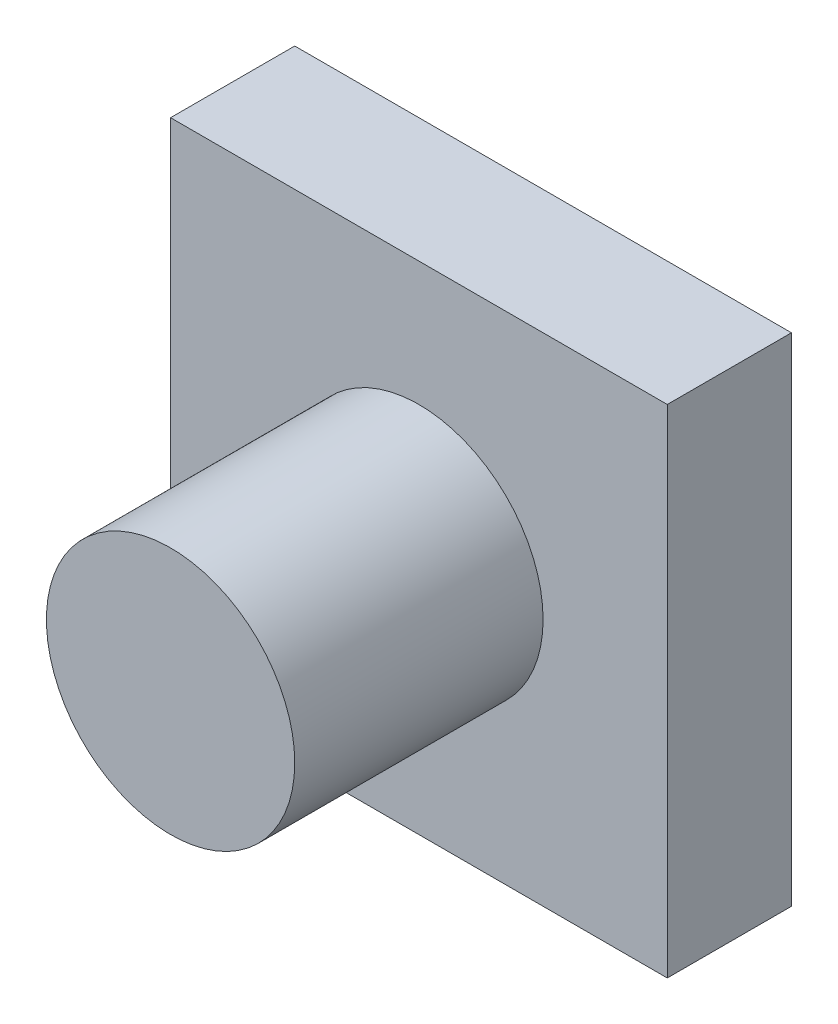
ISO-10303-21;
HEADER;
FILE_DESCRIPTION(('STEP AP214'),'2;1');
FILE_NAME('part.step','',(''),(''),'','','');
FILE_SCHEMA(('AUTOMOTIVE_DESIGN { 1 0 10303 214 1 1 1 1 }'));
ENDSEC;
DATA;
#1=APPLICATION_CONTEXT('core data for automotive mechanical design processes');
#2=APPLICATION_PROTOCOL_DEFINITION('international standard','automotive_design',2000,#1);
#3=PRODUCT_CONTEXT('',#1,'mechanical');
#4=PRODUCT('Part','Part','',(#3));
#5=PRODUCT_RELATED_PRODUCT_CATEGORY('part','',(#4));
#6=PRODUCT_DEFINITION_FORMATION('','',#4);
#7=PRODUCT_DEFINITION_CONTEXT('part definition',#1,'design');
#8=PRODUCT_DEFINITION('design','',#6,#7);
#9=PRODUCT_DEFINITION_SHAPE('','',#8);
#10=(LENGTH_UNIT() NAMED_UNIT(*) SI_UNIT(.MILLI.,.METRE.));
#11=(NAMED_UNIT(*) PLANE_ANGLE_UNIT() SI_UNIT($,.RADIAN.));
#12=(NAMED_UNIT(*) SI_UNIT($,.STERADIAN.) SOLID_ANGLE_UNIT());
#13=UNCERTAINTY_MEASURE_WITH_UNIT(LENGTH_MEASURE(1.E-05),#10,'distance_accuracy_value','');
#14=(GEOMETRIC_REPRESENTATION_CONTEXT(3) GLOBAL_UNCERTAINTY_ASSIGNED_CONTEXT((#13)) GLOBAL_UNIT_ASSIGNED_CONTEXT((#10,
#11,#12)) REPRESENTATION_CONTEXT('',''));
#15=CARTESIAN_POINT('',(0.,0.,0.));
#16=DIRECTION('',(0.,0.,1.));
#17=DIRECTION('',(1.,0.,0.));
#18=AXIS2_PLACEMENT_3D('',#15,#16,#17);
#19=CARTESIAN_POINT('',(-20.,-20.,10.));
#20=DIRECTION('',(0.,1.,0.));
#21=DIRECTION('',(0.,0.,1.));
#22=AXIS2_PLACEMENT_3D('',#19,#20,#21);
#23=PLANE('',#22);
#24=DIRECTION('',(1.,0.,0.));
#25=VECTOR('',#24,1.);
#26=CARTESIAN_POINT('',(-20.0000000000001,-20.,0.));
#27=LINE('',#26,#25);
#28=CARTESIAN_POINT('',(-20.0000000000001,-20.,0.));
#29=VERTEX_POINT('',#28);
#30=CARTESIAN_POINT('',(20.,-20.,0.));
#31=VERTEX_POINT('',#30);
#32=EDGE_CURVE('E117',#29,#31,#27,.T.);
#33=ORIENTED_EDGE('',*,*,#32,.T.);
#34=DIRECTION('',(0.,0.,-1.));
#35=VECTOR('',#34,1.);
#36=CARTESIAN_POINT('',(20.,-20.,10.));
#37=LINE('',#36,#35);
#38=CARTESIAN_POINT('',(20.,-20.,10.));
#39=VERTEX_POINT('',#38);
#40=EDGE_CURVE('E48',#39,#31,#37,.T.);
#41=ORIENTED_EDGE('',*,*,#40,.F.);
#42=DIRECTION('',(1.,0.,0.));
#43=VECTOR('',#42,1.);
#44=CARTESIAN_POINT('',(-20.,-20.,10.));
#45=LINE('',#44,#43);
#46=CARTESIAN_POINT('',(-20.,-20.,10.));
#47=VERTEX_POINT('',#46);
#48=EDGE_CURVE('E97',#47,#39,#45,.T.);
#49=ORIENTED_EDGE('',*,*,#48,.F.);
#50=DIRECTION('',(0.,0.,-1.));
#51=VECTOR('',#50,1.);
#52=CARTESIAN_POINT('',(-20.,-20.,10.));
#53=LINE('',#52,#51);
#54=EDGE_CURVE('E63',#47,#29,#53,.T.);
#55=ORIENTED_EDGE('',*,*,#54,.T.);
#56=EDGE_LOOP('',(#33,#41,#49,#55));
#57=FACE_BOUND('',#56,.T.);
#58=ADVANCED_FACE('F45',(#57),#23,.F.);
#59=CARTESIAN_POINT('',(20.,-20.,10.));
#60=DIRECTION('',(-1.,0.,0.));
#61=DIRECTION('',(0.,0.,1.));
#62=AXIS2_PLACEMENT_3D('',#59,#60,#61);
#63=PLANE('',#62);
#64=DIRECTION('',(0.,1.,0.));
#65=VECTOR('',#64,1.);
#66=CARTESIAN_POINT('',(20.,-20.,0.));
#67=LINE('',#66,#65);
#68=CARTESIAN_POINT('',(20.,20.,0.));
#69=VERTEX_POINT('',#68);
#70=EDGE_CURVE('E104',#31,#69,#67,.T.);
#71=ORIENTED_EDGE('',*,*,#70,.T.);
#72=DIRECTION('',(0.,0.,-1.));
#73=VECTOR('',#72,1.);
#74=CARTESIAN_POINT('',(20.,20.,10.));
#75=LINE('',#74,#73);
#76=CARTESIAN_POINT('',(20.,20.,10.));
#77=VERTEX_POINT('',#76);
#78=EDGE_CURVE('E102',#77,#69,#75,.T.);
#79=ORIENTED_EDGE('',*,*,#78,.F.);
#80=DIRECTION('',(0.,1.,0.));
#81=VECTOR('',#80,1.);
#82=CARTESIAN_POINT('',(20.,-20.,10.));
#83=LINE('',#82,#81);
#84=EDGE_CURVE('E89',#39,#77,#83,.T.);
#85=ORIENTED_EDGE('',*,*,#84,.F.);
#86=ORIENTED_EDGE('',*,*,#40,.T.);
#87=EDGE_LOOP('',(#71,#79,#85,#86));
#88=FACE_BOUND('',#87,.T.);
#89=ADVANCED_FACE('F103',(#88),#63,.F.);
#90=CARTESIAN_POINT('',(-20.0000000000001,20.,10.));
#91=DIRECTION('',(0.,1.,0.));
#92=DIRECTION('',(0.,0.,1.));
#93=AXIS2_PLACEMENT_3D('',#90,#91,#92);
#94=PLANE('',#93);
#95=DIRECTION('',(1.,0.,0.));
#96=VECTOR('',#95,1.);
#97=CARTESIAN_POINT('',(-20.0000000000001,20.,0.));
#98=LINE('',#97,#96);
#99=CARTESIAN_POINT('',(-20.0000000000001,20.,0.));
#100=VERTEX_POINT('',#99);
#101=EDGE_CURVE('E123',#100,#69,#98,.T.);
#102=ORIENTED_EDGE('',*,*,#101,.F.);
#103=DIRECTION('',(0.,0.,-1.));
#104=VECTOR('',#103,1.);
#105=CARTESIAN_POINT('',(-20.0000000000001,20.,10.));
#106=LINE('',#105,#104);
#107=CARTESIAN_POINT('',(-20.0000000000001,20.,10.));
#108=VERTEX_POINT('',#107);
#109=EDGE_CURVE('E77',#108,#100,#106,.T.);
#110=ORIENTED_EDGE('',*,*,#109,.F.);
#111=DIRECTION('',(1.,0.,0.));
#112=VECTOR('',#111,1.);
#113=CARTESIAN_POINT('',(-20.0000000000001,20.,10.));
#114=LINE('',#113,#112);
#115=EDGE_CURVE('E96',#108,#77,#114,.T.);
#116=ORIENTED_EDGE('',*,*,#115,.T.);
#117=ORIENTED_EDGE('',*,*,#78,.T.);
#118=EDGE_LOOP('',(#102,#110,#116,#117));
#119=FACE_BOUND('',#118,.T.);
#120=ADVANCED_FACE('F108',(#119),#94,.T.);
#121=CARTESIAN_POINT('',(-20.,-20.,10.));
#122=DIRECTION('',(-1.,0.,0.));
#123=DIRECTION('',(0.,0.,1.));
#124=AXIS2_PLACEMENT_3D('',#121,#122,#123);
#125=PLANE('',#124);
#126=DIRECTION('',(0.,1.,0.));
#127=VECTOR('',#126,1.);
#128=CARTESIAN_POINT('',(-20.0000000000001,-20.,0.));
#129=LINE('',#128,#127);
#130=EDGE_CURVE('E126',#29,#100,#129,.T.);
#131=ORIENTED_EDGE('',*,*,#130,.F.);
#132=ORIENTED_EDGE('',*,*,#54,.F.);
#133=DIRECTION('',(0.,1.,0.));
#134=VECTOR('',#133,1.);
#135=CARTESIAN_POINT('',(-20.,-20.,10.));
#136=LINE('',#135,#134);
#137=EDGE_CURVE('E110',#47,#108,#136,.T.);
#138=ORIENTED_EDGE('',*,*,#137,.T.);
#139=ORIENTED_EDGE('',*,*,#109,.T.);
#140=EDGE_LOOP('',(#131,#132,#138,#139));
#141=FACE_BOUND('',#140,.T.);
#142=ADVANCED_FACE('F142',(#141),#125,.T.);
#143=CARTESIAN_POINT('',(0.,0.,10.));
#144=DIRECTION('',(0.,0.,1.));
#145=DIRECTION('',(1.,0.,0.));
#146=AXIS2_PLACEMENT_3D('',#143,#144,#145);
#147=PLANE('',#146);
#148=CARTESIAN_POINT('',(0.,0.,10.));
#149=DIRECTION('',(0.,0.,1.));
#150=DIRECTION('',(1.,0.,0.));
#151=AXIS2_PLACEMENT_3D('',#148,#149,#150);
#152=CIRCLE('',#151,10.);
#153=CARTESIAN_POINT('',(9.99999999999997,0.,10.));
#154=VERTEX_POINT('',#153);
#155=EDGE_CURVE('E11',#154,#154,#152,.T.);
#156=ORIENTED_EDGE('',*,*,#155,.F.);
#157=EDGE_LOOP('',(#156));
#158=FACE_BOUND('',#157,.T.);
#159=ORIENTED_EDGE('',*,*,#48,.T.);
#160=ORIENTED_EDGE('',*,*,#84,.T.);
#161=ORIENTED_EDGE('',*,*,#115,.F.);
#162=ORIENTED_EDGE('',*,*,#137,.F.);
#163=EDGE_LOOP('',(#159,#160,#161,#162));
#164=FACE_BOUND('',#163,.T.);
#165=ADVANCED_FACE('F93',(#158,#164),#147,.T.);
#166=CARTESIAN_POINT('',(0.,0.,0.));
#167=DIRECTION('',(0.,0.,1.));
#168=DIRECTION('',(1.,0.,0.));
#169=AXIS2_PLACEMENT_3D('',#166,#167,#168);
#170=PLANE('',#169);
#171=ORIENTED_EDGE('',*,*,#32,.F.);
#172=ORIENTED_EDGE('',*,*,#130,.T.);
#173=ORIENTED_EDGE('',*,*,#101,.T.);
#174=ORIENTED_EDGE('',*,*,#70,.F.);
#175=EDGE_LOOP('',(#171,#172,#173,#174));
#176=FACE_BOUND('',#175,.T.);
#177=ADVANCED_FACE('F141',(#176),#170,.F.);
#178=CARTESIAN_POINT('',(0.,0.,30.0000000000001));
#179=DIRECTION('',(0.,0.,-1.));
#180=DIRECTION('',(-1.,0.,0.));
#181=AXIS2_PLACEMENT_3D('',#178,#179,#180);
#182=CYLINDRICAL_SURFACE('',#181,10.);
#183=CARTESIAN_POINT('',(0.,0.,30.0000000000001));
#184=DIRECTION('',(0.,0.,1.));
#185=DIRECTION('',(1.,0.,0.));
#186=AXIS2_PLACEMENT_3D('',#183,#184,#185);
#187=CIRCLE('',#186,10.);
#188=CARTESIAN_POINT('',(10.,0.,30.0000000000001));
#189=VERTEX_POINT('',#188);
#190=EDGE_CURVE('E120',#189,#189,#187,.T.);
#191=ORIENTED_EDGE('',*,*,#190,.F.);
#192=EDGE_LOOP('',(#191));
#193=FACE_BOUND('',#192,.T.);
#194=ORIENTED_EDGE('',*,*,#155,.T.);
#195=EDGE_LOOP('',(#194));
#196=FACE_BOUND('',#195,.T.);
#197=ADVANCED_FACE('F180',(#193,#196),#182,.T.);
#198=CARTESIAN_POINT('',(0.,0.,30.0000000000001));
#199=DIRECTION('',(0.,0.,1.));
#200=DIRECTION('',(1.,0.,0.));
#201=AXIS2_PLACEMENT_3D('',#198,#199,#200);
#202=PLANE('',#201);
#203=ORIENTED_EDGE('',*,*,#190,.T.);
#204=EDGE_LOOP('',(#203));
#205=FACE_BOUND('',#204,.T.);
#206=ADVANCED_FACE('F186',(#205),#202,.T.);
#207=CLOSED_SHELL('',(#58,#89,#120,#142,#165,#177,#197,#206));
#208=MANIFOLD_SOLID_BREP('B2',#207);
#209=ADVANCED_BREP_SHAPE_REPRESENTATION('',(#18,#208),#14);
#210=SHAPE_DEFINITION_REPRESENTATION(#9,#209);
ENDSEC;
END-ISO-10303-21;
